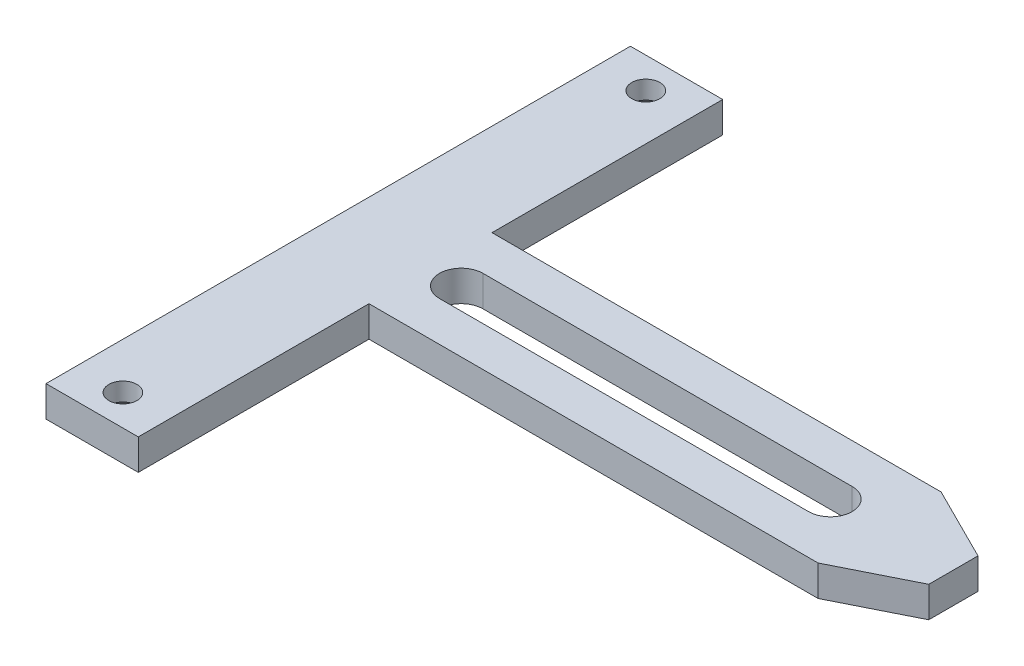
ISO-10303-21;
HEADER;
FILE_DESCRIPTION(('STEP AP214'),'2;1');
FILE_NAME('part.step','',(''),(''),'','','');
FILE_SCHEMA(('AUTOMOTIVE_DESIGN { 1 0 10303 214 1 1 1 1 }'));
ENDSEC;
DATA;
#1=APPLICATION_CONTEXT('core data for automotive mechanical design processes');
#2=APPLICATION_PROTOCOL_DEFINITION('international standard','automotive_design',2000,#1);
#3=PRODUCT_CONTEXT('',#1,'mechanical');
#4=PRODUCT('Part','Part','',(#3));
#5=PRODUCT_RELATED_PRODUCT_CATEGORY('part','',(#4));
#6=PRODUCT_DEFINITION_FORMATION('','',#4);
#7=PRODUCT_DEFINITION_CONTEXT('part definition',#1,'design');
#8=PRODUCT_DEFINITION('design','',#6,#7);
#9=PRODUCT_DEFINITION_SHAPE('','',#8);
#10=(LENGTH_UNIT() NAMED_UNIT(*) SI_UNIT(.MILLI.,.METRE.));
#11=(NAMED_UNIT(*) PLANE_ANGLE_UNIT() SI_UNIT($,.RADIAN.));
#12=(NAMED_UNIT(*) SI_UNIT($,.STERADIAN.) SOLID_ANGLE_UNIT());
#13=UNCERTAINTY_MEASURE_WITH_UNIT(LENGTH_MEASURE(1.E-05),#10,'distance_accuracy_value','');
#14=(GEOMETRIC_REPRESENTATION_CONTEXT(3) GLOBAL_UNCERTAINTY_ASSIGNED_CONTEXT((#13)) GLOBAL_UNIT_ASSIGNED_CONTEXT((#10,
#11,#12)) REPRESENTATION_CONTEXT('',''));
#15=CARTESIAN_POINT('',(0.,0.,0.));
#16=DIRECTION('',(0.,0.,1.));
#17=DIRECTION('',(1.,0.,0.));
#18=AXIS2_PLACEMENT_3D('',#15,#16,#17);
#19=CARTESIAN_POINT('',(-31.75,1.5875,30.1625));
#20=DIRECTION('',(-1.,0.,0.));
#21=DIRECTION('',(0.,0.,1.));
#22=AXIS2_PLACEMENT_3D('',#19,#20,#21);
#23=PLANE('',#22);
#24=DIRECTION('',(0.,0.,-1.));
#25=VECTOR('',#24,1.);
#26=CARTESIAN_POINT('',(-31.75,-1.5875,30.1625));
#27=LINE('',#26,#25);
#28=CARTESIAN_POINT('',(-31.75,-1.5875,30.1625));
#29=VERTEX_POINT('',#28);
#30=CARTESIAN_POINT('',(-31.75,-1.5875,-30.1625));
#31=VERTEX_POINT('',#30);
#32=EDGE_CURVE('E218',#29,#31,#27,.T.);
#33=ORIENTED_EDGE('',*,*,#32,.F.);
#34=DIRECTION('',(0.,-1.,0.));
#35=VECTOR('',#34,1.);
#36=CARTESIAN_POINT('',(-31.75,1.5875,30.1625));
#37=LINE('',#36,#35);
#38=CARTESIAN_POINT('',(-31.75,1.5875,30.1625));
#39=VERTEX_POINT('',#38);
#40=EDGE_CURVE('E11',#39,#29,#37,.T.);
#41=ORIENTED_EDGE('',*,*,#40,.F.);
#42=DIRECTION('',(0.,0.,-1.));
#43=VECTOR('',#42,1.);
#44=CARTESIAN_POINT('',(-31.75,1.5875,30.1625));
#45=LINE('',#44,#43);
#46=CARTESIAN_POINT('',(-31.75,1.5875,-30.1625));
#47=VERTEX_POINT('',#46);
#48=EDGE_CURVE('E260',#39,#47,#45,.T.);
#49=ORIENTED_EDGE('',*,*,#48,.T.);
#50=DIRECTION('',(0.,-1.,0.));
#51=VECTOR('',#50,1.);
#52=CARTESIAN_POINT('',(-31.75,1.5875,-30.1625));
#53=LINE('',#52,#51);
#54=EDGE_CURVE('E45',#47,#31,#53,.T.);
#55=ORIENTED_EDGE('',*,*,#54,.T.);
#56=EDGE_LOOP('',(#33,#41,#49,#55));
#57=FACE_BOUND('',#56,.T.);
#58=ADVANCED_FACE('F42',(#57),#23,.T.);
#59=CARTESIAN_POINT('',(-31.75,1.5875,30.1625));
#60=DIRECTION('',(0.,0.,-1.));
#61=DIRECTION('',(-1.,0.,0.));
#62=AXIS2_PLACEMENT_3D('',#59,#60,#61);
#63=PLANE('',#62);
#64=DIRECTION('',(1.,0.,0.));
#65=VECTOR('',#64,1.);
#66=CARTESIAN_POINT('',(-31.75,-1.5875,30.1625));
#67=LINE('',#66,#65);
#68=CARTESIAN_POINT('',(-22.225,-1.5875,30.1625));
#69=VERTEX_POINT('',#68);
#70=EDGE_CURVE('E265',#29,#69,#67,.T.);
#71=ORIENTED_EDGE('',*,*,#70,.T.);
#72=DIRECTION('',(0.,1.,0.));
#73=VECTOR('',#72,1.);
#74=CARTESIAN_POINT('',(-22.225,-1.5885,30.1625));
#75=LINE('',#74,#73);
#76=CARTESIAN_POINT('',(-22.225,1.5875,30.1625));
#77=VERTEX_POINT('',#76);
#78=EDGE_CURVE('E248',#69,#77,#75,.T.);
#79=ORIENTED_EDGE('',*,*,#78,.T.);
#80=DIRECTION('',(1.,0.,0.));
#81=VECTOR('',#80,1.);
#82=CARTESIAN_POINT('',(-31.75,1.5875,30.1625));
#83=LINE('',#82,#81);
#84=EDGE_CURVE('E273',#39,#77,#83,.T.);
#85=ORIENTED_EDGE('',*,*,#84,.F.);
#86=ORIENTED_EDGE('',*,*,#40,.T.);
#87=EDGE_LOOP('',(#71,#79,#85,#86));
#88=FACE_BOUND('',#87,.T.);
#89=ADVANCED_FACE('F292',(#88),#63,.F.);
#90=CARTESIAN_POINT('',(31.75,1.5875,30.1625));
#91=DIRECTION('',(-1.,0.,0.));
#92=DIRECTION('',(0.,0.,1.));
#93=AXIS2_PLACEMENT_3D('',#90,#91,#92);
#94=PLANE('',#93);
#95=DIRECTION('',(0.,0.,-1.));
#96=VECTOR('',#95,1.);
#97=CARTESIAN_POINT('',(31.75,-1.5875,30.1625));
#98=LINE('',#97,#96);
#99=CARTESIAN_POINT('',(31.75,-1.5875,2.54000000000001));
#100=VERTEX_POINT('',#99);
#101=CARTESIAN_POINT('',(31.75,-1.5875,-2.53999999999999));
#102=VERTEX_POINT('',#101);
#103=EDGE_CURVE('E284',#100,#102,#98,.T.);
#104=ORIENTED_EDGE('',*,*,#103,.T.);
#105=DIRECTION('',(0.,1.,0.));
#106=VECTOR('',#105,1.);
#107=CARTESIAN_POINT('',(31.75,-1.5885,-2.54));
#108=LINE('',#107,#106);
#109=CARTESIAN_POINT('',(31.75,1.5875,-2.54));
#110=VERTEX_POINT('',#109);
#111=EDGE_CURVE('E214',#102,#110,#108,.T.);
#112=ORIENTED_EDGE('',*,*,#111,.T.);
#113=DIRECTION('',(0.,0.,-1.));
#114=VECTOR('',#113,1.);
#115=CARTESIAN_POINT('',(31.75,1.5875,30.1625));
#116=LINE('',#115,#114);
#117=CARTESIAN_POINT('',(31.75,1.5875,2.54));
#118=VERTEX_POINT('',#117);
#119=EDGE_CURVE('E269',#118,#110,#116,.T.);
#120=ORIENTED_EDGE('',*,*,#119,.F.);
#121=DIRECTION('',(0.,1.,0.));
#122=VECTOR('',#121,1.);
#123=CARTESIAN_POINT('',(31.75,-1.5885,2.54));
#124=LINE('',#123,#122);
#125=EDGE_CURVE('E245',#100,#118,#124,.T.);
#126=ORIENTED_EDGE('',*,*,#125,.F.);
#127=EDGE_LOOP('',(#104,#112,#120,#126));
#128=FACE_BOUND('',#127,.T.);
#129=ADVANCED_FACE('F318',(#128),#94,.F.);
#130=CARTESIAN_POINT('',(-31.75,1.5875,-30.1625));
#131=DIRECTION('',(0.,0.,-1.));
#132=DIRECTION('',(-1.,0.,0.));
#133=AXIS2_PLACEMENT_3D('',#130,#131,#132);
#134=PLANE('',#133);
#135=DIRECTION('',(0.,1.,0.));
#136=VECTOR('',#135,1.);
#137=CARTESIAN_POINT('',(-22.225,-1.5885,-30.1625));
#138=LINE('',#137,#136);
#139=CARTESIAN_POINT('',(-22.225,-1.5875,-30.1625));
#140=VERTEX_POINT('',#139);
#141=CARTESIAN_POINT('',(-22.225,1.5875,-30.1625));
#142=VERTEX_POINT('',#141);
#143=EDGE_CURVE('E213',#140,#142,#138,.T.);
#144=ORIENTED_EDGE('',*,*,#143,.F.);
#145=DIRECTION('',(1.,0.,0.));
#146=VECTOR('',#145,1.);
#147=CARTESIAN_POINT('',(-31.75,-1.5875,-30.1625));
#148=LINE('',#147,#146);
#149=EDGE_CURVE('E280',#31,#140,#148,.T.);
#150=ORIENTED_EDGE('',*,*,#149,.F.);
#151=ORIENTED_EDGE('',*,*,#54,.F.);
#152=DIRECTION('',(1.,0.,0.));
#153=VECTOR('',#152,1.);
#154=CARTESIAN_POINT('',(-31.75,1.5875,-30.1625));
#155=LINE('',#154,#153);
#156=EDGE_CURVE('E264',#47,#142,#155,.T.);
#157=ORIENTED_EDGE('',*,*,#156,.T.);
#158=EDGE_LOOP('',(#144,#150,#151,#157));
#159=FACE_BOUND('',#158,.T.);
#160=ADVANCED_FACE('F303',(#159),#134,.T.);
#161=CARTESIAN_POINT('',(0.,1.5875,0.));
#162=DIRECTION('',(0.,-1.,0.));
#163=DIRECTION('',(0.,0.,-1.));
#164=AXIS2_PLACEMENT_3D('',#161,#162,#163);
#165=PLANE('',#164);
#166=CARTESIAN_POINT('',(-26.9875,1.5875,-26.9875));
#167=DIRECTION('',(0.,-1.,0.));
#168=DIRECTION('',(0.,0.,-1.));
#169=AXIS2_PLACEMENT_3D('',#166,#167,#168);
#170=CIRCLE('',#169,1.44999999999999);
#171=CARTESIAN_POINT('',(-26.9875,1.5875,-28.4375));
#172=VERTEX_POINT('',#171);
#173=EDGE_CURVE('E364',#172,#172,#170,.T.);
#174=ORIENTED_EDGE('',*,*,#173,.T.);
#175=EDGE_LOOP('',(#174));
#176=FACE_BOUND('',#175,.T.);
#177=CARTESIAN_POINT('',(-26.9875,1.5875,26.9875));
#178=DIRECTION('',(0.,-1.,0.));
#179=DIRECTION('',(0.,0.,-1.));
#180=AXIS2_PLACEMENT_3D('',#177,#178,#179);
#181=CIRCLE('',#180,1.44999999999999);
#182=CARTESIAN_POINT('',(-26.9875,1.5875,25.5375));
#183=VERTEX_POINT('',#182);
#184=EDGE_CURVE('E368',#183,#183,#181,.T.);
#185=ORIENTED_EDGE('',*,*,#184,.T.);
#186=EDGE_LOOP('',(#185));
#187=FACE_BOUND('',#186,.T.);
#188=DIRECTION('',(1.,0.,0.));
#189=VECTOR('',#188,1.);
#190=CARTESIAN_POINT('',(-19.05,1.5875,2.2479));
#191=LINE('',#190,#189);
#192=CARTESIAN_POINT('',(-19.05,1.5875,2.2479));
#193=VERTEX_POINT('',#192);
#194=CARTESIAN_POINT('',(19.05,1.5875,2.2479));
#195=VERTEX_POINT('',#194);
#196=EDGE_CURVE('E167',#193,#195,#191,.T.);
#197=ORIENTED_EDGE('',*,*,#196,.F.);
#198=CARTESIAN_POINT('',(-19.05,1.5875,0.));
#199=DIRECTION('',(0.,1.,0.));
#200=DIRECTION('',(0.,0.,1.));
#201=AXIS2_PLACEMENT_3D('',#198,#199,#200);
#202=CIRCLE('',#201,2.2479);
#203=CARTESIAN_POINT('',(-19.05,1.5875,-2.2479));
#204=VERTEX_POINT('',#203);
#205=EDGE_CURVE('E57',#204,#193,#202,.T.);
#206=ORIENTED_EDGE('',*,*,#205,.F.);
#207=DIRECTION('',(1.,0.,0.));
#208=VECTOR('',#207,1.);
#209=CARTESIAN_POINT('',(-19.05,1.5875,-2.2479));
#210=LINE('',#209,#208);
#211=CARTESIAN_POINT('',(19.05,1.5875,-2.2479));
#212=VERTEX_POINT('',#211);
#213=EDGE_CURVE('E156',#204,#212,#210,.T.);
#214=ORIENTED_EDGE('',*,*,#213,.T.);
#215=CARTESIAN_POINT('',(19.05,1.5875,0.));
#216=DIRECTION('',(0.,1.,0.));
#217=DIRECTION('',(0.,0.,1.));
#218=AXIS2_PLACEMENT_3D('',#215,#216,#217);
#219=CIRCLE('',#218,2.2479);
#220=EDGE_CURVE('E176',#195,#212,#219,.T.);
#221=ORIENTED_EDGE('',*,*,#220,.F.);
#222=EDGE_LOOP('',(#197,#206,#214,#221));
#223=FACE_BOUND('',#222,.T.);
#224=ORIENTED_EDGE('',*,*,#119,.T.);
#225=DIRECTION('',(0.894427190999916,0.,0.447213595499958));
#226=VECTOR('',#225,1.);
#227=CARTESIAN_POINT('',(31.75,1.5875,-2.54));
#228=LINE('',#227,#226);
#229=CARTESIAN_POINT('',(24.13,1.5875,-6.35));
#230=VERTEX_POINT('',#229);
#231=EDGE_CURVE('E210',#230,#110,#228,.T.);
#232=ORIENTED_EDGE('',*,*,#231,.F.);
#233=DIRECTION('',(1.,0.,0.));
#234=VECTOR('',#233,1.);
#235=CARTESIAN_POINT('',(24.13,1.5875,-6.35));
#236=LINE('',#235,#234);
#237=CARTESIAN_POINT('',(-22.225,1.5875,-6.35));
#238=VERTEX_POINT('',#237);
#239=EDGE_CURVE('E206',#238,#230,#236,.T.);
#240=ORIENTED_EDGE('',*,*,#239,.F.);
#241=DIRECTION('',(0.,0.,1.));
#242=VECTOR('',#241,1.);
#243=CARTESIAN_POINT('',(-22.225,1.5875,-30.1625));
#244=LINE('',#243,#242);
#245=EDGE_CURVE('E202',#142,#238,#244,.T.);
#246=ORIENTED_EDGE('',*,*,#245,.F.);
#247=ORIENTED_EDGE('',*,*,#156,.F.);
#248=ORIENTED_EDGE('',*,*,#48,.F.);
#249=ORIENTED_EDGE('',*,*,#84,.T.);
#250=DIRECTION('',(0.,0.,1.));
#251=VECTOR('',#250,1.);
#252=CARTESIAN_POINT('',(-22.225,1.5875,30.1625));
#253=LINE('',#252,#251);
#254=CARTESIAN_POINT('',(-22.225,1.5875,6.35));
#255=VERTEX_POINT('',#254);
#256=EDGE_CURVE('E241',#255,#77,#253,.T.);
#257=ORIENTED_EDGE('',*,*,#256,.F.);
#258=DIRECTION('',(-1.,0.,0.));
#259=VECTOR('',#258,1.);
#260=CARTESIAN_POINT('',(24.13,1.5875,6.35));
#261=LINE('',#260,#259);
#262=CARTESIAN_POINT('',(24.13,1.5875,6.35));
#263=VERTEX_POINT('',#262);
#264=EDGE_CURVE('E237',#263,#255,#261,.T.);
#265=ORIENTED_EDGE('',*,*,#264,.F.);
#266=DIRECTION('',(-0.894427190999916,0.,0.447213595499958));
#267=VECTOR('',#266,1.);
#268=CARTESIAN_POINT('',(31.75,1.5875,2.54));
#269=LINE('',#268,#267);
#270=EDGE_CURVE('E233',#118,#263,#269,.T.);
#271=ORIENTED_EDGE('',*,*,#270,.F.);
#272=EDGE_LOOP('',(#224,#232,#240,#246,#247,#248,#249,#257,#265,#271));
#273=FACE_BOUND('',#272,.T.);
#274=ADVANCED_FACE('F326',(#176,#187,#223,#273),#165,.F.);
#275=CARTESIAN_POINT('',(0.,-1.5875,0.));
#276=DIRECTION('',(0.,-1.,0.));
#277=DIRECTION('',(0.,0.,-1.));
#278=AXIS2_PLACEMENT_3D('',#275,#276,#277);
#279=PLANE('',#278);
#280=CARTESIAN_POINT('',(-26.9875,-1.5875,-26.9875));
#281=DIRECTION('',(0.,-1.,0.));
#282=DIRECTION('',(0.,0.,-1.));
#283=AXIS2_PLACEMENT_3D('',#280,#281,#282);
#284=CIRCLE('',#283,2.75);
#285=CARTESIAN_POINT('',(-26.9875,-1.5875,-29.7375));
#286=VERTEX_POINT('',#285);
#287=EDGE_CURVE('E392',#286,#286,#284,.T.);
#288=ORIENTED_EDGE('',*,*,#287,.F.);
#289=EDGE_LOOP('',(#288));
#290=FACE_BOUND('',#289,.T.);
#291=CARTESIAN_POINT('',(-26.9875,-1.5875,26.9875));
#292=DIRECTION('',(0.,-1.,0.));
#293=DIRECTION('',(0.,0.,-1.));
#294=AXIS2_PLACEMENT_3D('',#291,#292,#293);
#295=CIRCLE('',#294,2.75);
#296=CARTESIAN_POINT('',(-26.9875,-1.5875,24.2375));
#297=VERTEX_POINT('',#296);
#298=EDGE_CURVE('E382',#297,#297,#295,.T.);
#299=ORIENTED_EDGE('',*,*,#298,.F.);
#300=EDGE_LOOP('',(#299));
#301=FACE_BOUND('',#300,.T.);
#302=CARTESIAN_POINT('',(-19.05,-1.5875,0.));
#303=DIRECTION('',(0.,-1.,0.));
#304=DIRECTION('',(0.,0.,-1.));
#305=AXIS2_PLACEMENT_3D('',#302,#303,#304);
#306=CIRCLE('',#305,2.2479);
#307=CARTESIAN_POINT('',(-19.05,-1.5875,-2.2479));
#308=VERTEX_POINT('',#307);
#309=CARTESIAN_POINT('',(-19.05,-1.5875,2.2479));
#310=VERTEX_POINT('',#309);
#311=EDGE_CURVE('E153',#308,#310,#306,.F.);
#312=ORIENTED_EDGE('',*,*,#311,.T.);
#313=DIRECTION('',(1.,0.,0.));
#314=VECTOR('',#313,1.);
#315=CARTESIAN_POINT('',(-19.05,-1.5875,2.2479));
#316=LINE('',#315,#314);
#317=CARTESIAN_POINT('',(19.05,-1.5875,2.2479));
#318=VERTEX_POINT('',#317);
#319=EDGE_CURVE('E141',#310,#318,#316,.T.);
#320=ORIENTED_EDGE('',*,*,#319,.T.);
#321=CARTESIAN_POINT('',(19.05,-1.5875,0.));
#322=DIRECTION('',(0.,-1.,0.));
#323=DIRECTION('',(0.,0.,-1.));
#324=AXIS2_PLACEMENT_3D('',#321,#322,#323);
#325=CIRCLE('',#324,2.2479);
#326=CARTESIAN_POINT('',(19.05,-1.5875,-2.2479));
#327=VERTEX_POINT('',#326);
#328=EDGE_CURVE('E170',#318,#327,#325,.F.);
#329=ORIENTED_EDGE('',*,*,#328,.T.);
#330=DIRECTION('',(1.,0.,0.));
#331=VECTOR('',#330,1.);
#332=CARTESIAN_POINT('',(-19.05,-1.5875,-2.2479));
#333=LINE('',#332,#331);
#334=EDGE_CURVE('E161',#308,#327,#333,.T.);
#335=ORIENTED_EDGE('',*,*,#334,.F.);
#336=EDGE_LOOP('',(#312,#320,#329,#335));
#337=FACE_BOUND('',#336,.T.);
#338=DIRECTION('',(0.894427190999916,0.,0.447213595499958));
#339=VECTOR('',#338,1.);
#340=CARTESIAN_POINT('',(31.75,-1.5875,-2.54));
#341=LINE('',#340,#339);
#342=CARTESIAN_POINT('',(24.13,-1.5875,-6.35));
#343=VERTEX_POINT('',#342);
#344=EDGE_CURVE('E198',#343,#102,#341,.T.);
#345=ORIENTED_EDGE('',*,*,#344,.T.);
#346=ORIENTED_EDGE('',*,*,#103,.F.);
#347=DIRECTION('',(-0.894427190999916,0.,0.447213595499958));
#348=VECTOR('',#347,1.);
#349=CARTESIAN_POINT('',(31.75,-1.5875,2.54));
#350=LINE('',#349,#348);
#351=CARTESIAN_POINT('',(24.13,-1.5875,6.35));
#352=VERTEX_POINT('',#351);
#353=EDGE_CURVE('E229',#100,#352,#350,.T.);
#354=ORIENTED_EDGE('',*,*,#353,.T.);
#355=DIRECTION('',(-1.,0.,0.));
#356=VECTOR('',#355,1.);
#357=CARTESIAN_POINT('',(24.13,-1.5875,6.35));
#358=LINE('',#357,#356);
#359=CARTESIAN_POINT('',(-22.225,-1.5875,6.35));
#360=VERTEX_POINT('',#359);
#361=EDGE_CURVE('E194',#352,#360,#358,.T.);
#362=ORIENTED_EDGE('',*,*,#361,.T.);
#363=DIRECTION('',(0.,0.,1.));
#364=VECTOR('',#363,1.);
#365=CARTESIAN_POINT('',(-22.225,-1.5875,30.1625));
#366=LINE('',#365,#364);
#367=EDGE_CURVE('E149',#360,#69,#366,.T.);
#368=ORIENTED_EDGE('',*,*,#367,.T.);
#369=ORIENTED_EDGE('',*,*,#70,.F.);
#370=ORIENTED_EDGE('',*,*,#32,.T.);
#371=ORIENTED_EDGE('',*,*,#149,.T.);
#372=DIRECTION('',(0.,0.,1.));
#373=VECTOR('',#372,1.);
#374=CARTESIAN_POINT('',(-22.225,-1.5875,-30.1625));
#375=LINE('',#374,#373);
#376=CARTESIAN_POINT('',(-22.225,-1.5875,-6.35));
#377=VERTEX_POINT('',#376);
#378=EDGE_CURVE('E189',#140,#377,#375,.T.);
#379=ORIENTED_EDGE('',*,*,#378,.T.);
#380=DIRECTION('',(1.,0.,0.));
#381=VECTOR('',#380,1.);
#382=CARTESIAN_POINT('',(24.13,-1.5875,-6.35));
#383=LINE('',#382,#381);
#384=EDGE_CURVE('E193',#377,#343,#383,.T.);
#385=ORIENTED_EDGE('',*,*,#384,.T.);
#386=EDGE_LOOP('',(#345,#346,#354,#362,#368,#369,#370,#371,#379,#385));
#387=FACE_BOUND('',#386,.T.);
#388=ADVANCED_FACE('F159',(#290,#301,#337,#387),#279,.T.);
#389=CARTESIAN_POINT('',(31.75,-1.5885,2.54));
#390=DIRECTION('',(-0.447213595499958,0.,-0.894427190999916));
#391=DIRECTION('',(-0.894427190999916,0.,0.447213595499958));
#392=AXIS2_PLACEMENT_3D('',#389,#390,#391);
#393=PLANE('',#392);
#394=ORIENTED_EDGE('',*,*,#125,.T.);
#395=ORIENTED_EDGE('',*,*,#270,.T.);
#396=DIRECTION('',(0.,1.,0.));
#397=VECTOR('',#396,1.);
#398=CARTESIAN_POINT('',(24.13,-1.5885,6.35));
#399=LINE('',#398,#397);
#400=EDGE_CURVE('E244',#352,#263,#399,.T.);
#401=ORIENTED_EDGE('',*,*,#400,.F.);
#402=ORIENTED_EDGE('',*,*,#353,.F.);
#403=EDGE_LOOP('',(#394,#395,#401,#402));
#404=FACE_BOUND('',#403,.T.);
#405=ADVANCED_FACE('F322',(#404),#393,.F.);
#406=CARTESIAN_POINT('',(-22.225,-1.5885,30.1625));
#407=DIRECTION('',(-1.,0.,0.));
#408=DIRECTION('',(0.,0.,1.));
#409=AXIS2_PLACEMENT_3D('',#406,#407,#408);
#410=PLANE('',#409);
#411=DIRECTION('',(0.,1.,0.));
#412=VECTOR('',#411,1.);
#413=CARTESIAN_POINT('',(-22.225,-1.5885,6.35));
#414=LINE('',#413,#412);
#415=EDGE_CURVE('E252',#360,#255,#414,.T.);
#416=ORIENTED_EDGE('',*,*,#415,.T.);
#417=ORIENTED_EDGE('',*,*,#256,.T.);
#418=ORIENTED_EDGE('',*,*,#78,.F.);
#419=ORIENTED_EDGE('',*,*,#367,.F.);
#420=EDGE_LOOP('',(#416,#417,#418,#419));
#421=FACE_BOUND('',#420,.T.);
#422=ADVANCED_FACE('F331',(#421),#410,.F.);
#423=CARTESIAN_POINT('',(24.13,-1.5885,6.35));
#424=DIRECTION('',(0.,0.,-1.));
#425=DIRECTION('',(-1.,0.,0.));
#426=AXIS2_PLACEMENT_3D('',#423,#424,#425);
#427=PLANE('',#426);
#428=ORIENTED_EDGE('',*,*,#400,.T.);
#429=ORIENTED_EDGE('',*,*,#264,.T.);
#430=ORIENTED_EDGE('',*,*,#415,.F.);
#431=ORIENTED_EDGE('',*,*,#361,.F.);
#432=EDGE_LOOP('',(#428,#429,#430,#431));
#433=FACE_BOUND('',#432,.T.);
#434=ADVANCED_FACE('F329',(#433),#427,.F.);
#435=CARTESIAN_POINT('',(31.75,-1.5885,-2.54));
#436=DIRECTION('',(-0.447213595499958,0.,0.894427190999916));
#437=DIRECTION('',(0.894427190999916,0.,0.447213595499958));
#438=AXIS2_PLACEMENT_3D('',#435,#436,#437);
#439=PLANE('',#438);
#440=DIRECTION('',(0.,1.,0.));
#441=VECTOR('',#440,1.);
#442=CARTESIAN_POINT('',(24.13,-1.5885,-6.35));
#443=LINE('',#442,#441);
#444=EDGE_CURVE('E219',#343,#230,#443,.T.);
#445=ORIENTED_EDGE('',*,*,#444,.T.);
#446=ORIENTED_EDGE('',*,*,#231,.T.);
#447=ORIENTED_EDGE('',*,*,#111,.F.);
#448=ORIENTED_EDGE('',*,*,#344,.F.);
#449=EDGE_LOOP('',(#445,#446,#447,#448));
#450=FACE_BOUND('',#449,.T.);
#451=ADVANCED_FACE('F314',(#450),#439,.F.);
#452=CARTESIAN_POINT('',(24.13,-1.5885,-6.35));
#453=DIRECTION('',(0.,0.,1.));
#454=DIRECTION('',(1.,0.,0.));
#455=AXIS2_PLACEMENT_3D('',#452,#453,#454);
#456=PLANE('',#455);
#457=DIRECTION('',(0.,1.,0.));
#458=VECTOR('',#457,1.);
#459=CARTESIAN_POINT('',(-22.225,-1.5885,-6.35));
#460=LINE('',#459,#458);
#461=EDGE_CURVE('E222',#377,#238,#460,.T.);
#462=ORIENTED_EDGE('',*,*,#461,.T.);
#463=ORIENTED_EDGE('',*,*,#239,.T.);
#464=ORIENTED_EDGE('',*,*,#444,.F.);
#465=ORIENTED_EDGE('',*,*,#384,.F.);
#466=EDGE_LOOP('',(#462,#463,#464,#465));
#467=FACE_BOUND('',#466,.T.);
#468=ADVANCED_FACE('F311',(#467),#456,.F.);
#469=CARTESIAN_POINT('',(-22.225,-1.5885,-30.1625));
#470=DIRECTION('',(-1.,0.,0.));
#471=DIRECTION('',(0.,0.,1.));
#472=AXIS2_PLACEMENT_3D('',#469,#470,#471);
#473=PLANE('',#472);
#474=ORIENTED_EDGE('',*,*,#143,.T.);
#475=ORIENTED_EDGE('',*,*,#245,.T.);
#476=ORIENTED_EDGE('',*,*,#461,.F.);
#477=ORIENTED_EDGE('',*,*,#378,.F.);
#478=EDGE_LOOP('',(#474,#475,#476,#477));
#479=FACE_BOUND('',#478,.T.);
#480=ADVANCED_FACE('F306',(#479),#473,.F.);
#481=CARTESIAN_POINT('',(-19.05,-1.5885,0.));
#482=DIRECTION('',(0.,1.,0.));
#483=DIRECTION('',(0.,0.,1.));
#484=AXIS2_PLACEMENT_3D('',#481,#482,#483);
#485=CYLINDRICAL_SURFACE('',#484,2.2479);
#486=DIRECTION('',(0.,1.,0.));
#487=VECTOR('',#486,1.);
#488=CARTESIAN_POINT('',(-19.05,-1.5885,-2.2479));
#489=LINE('',#488,#487);
#490=EDGE_CURVE('E150',#308,#204,#489,.T.);
#491=ORIENTED_EDGE('',*,*,#490,.T.);
#492=ORIENTED_EDGE('',*,*,#205,.T.);
#493=DIRECTION('',(0.,1.,0.));
#494=VECTOR('',#493,1.);
#495=CARTESIAN_POINT('',(-19.05,-1.5885,2.2479));
#496=LINE('',#495,#494);
#497=EDGE_CURVE('E143',#310,#193,#496,.T.);
#498=ORIENTED_EDGE('',*,*,#497,.F.);
#499=ORIENTED_EDGE('',*,*,#311,.F.);
#500=EDGE_LOOP('',(#491,#492,#498,#499));
#501=FACE_BOUND('',#500,.T.);
#502=ADVANCED_FACE('F152',(#501),#485,.F.);
#503=CARTESIAN_POINT('',(-19.05,-1.5885,-2.2479));
#504=DIRECTION('',(0.,0.,1.));
#505=DIRECTION('',(1.,0.,0.));
#506=AXIS2_PLACEMENT_3D('',#503,#504,#505);
#507=PLANE('',#506);
#508=ORIENTED_EDGE('',*,*,#334,.T.);
#509=DIRECTION('',(0.,1.,0.));
#510=VECTOR('',#509,1.);
#511=CARTESIAN_POINT('',(19.05,-1.5885,-2.2479));
#512=LINE('',#511,#510);
#513=EDGE_CURVE('E185',#327,#212,#512,.T.);
#514=ORIENTED_EDGE('',*,*,#513,.T.);
#515=ORIENTED_EDGE('',*,*,#213,.F.);
#516=ORIENTED_EDGE('',*,*,#490,.F.);
#517=EDGE_LOOP('',(#508,#514,#515,#516));
#518=FACE_BOUND('',#517,.T.);
#519=ADVANCED_FACE('F418',(#518),#507,.T.);
#520=CARTESIAN_POINT('',(19.05,-1.5885,0.));
#521=DIRECTION('',(0.,1.,0.));
#522=DIRECTION('',(0.,0.,1.));
#523=AXIS2_PLACEMENT_3D('',#520,#521,#522);
#524=CYLINDRICAL_SURFACE('',#523,2.2479);
#525=DIRECTION('',(0.,1.,0.));
#526=VECTOR('',#525,1.);
#527=CARTESIAN_POINT('',(19.05,-1.5885,2.2479));
#528=LINE('',#527,#526);
#529=EDGE_CURVE('E65',#318,#195,#528,.T.);
#530=ORIENTED_EDGE('',*,*,#529,.T.);
#531=ORIENTED_EDGE('',*,*,#220,.T.);
#532=ORIENTED_EDGE('',*,*,#513,.F.);
#533=ORIENTED_EDGE('',*,*,#328,.F.);
#534=EDGE_LOOP('',(#530,#531,#532,#533));
#535=FACE_BOUND('',#534,.T.);
#536=ADVANCED_FACE('F373',(#535),#524,.F.);
#537=CARTESIAN_POINT('',(-19.05,-1.5885,2.2479));
#538=DIRECTION('',(0.,0.,1.));
#539=DIRECTION('',(1.,0.,0.));
#540=AXIS2_PLACEMENT_3D('',#537,#538,#539);
#541=PLANE('',#540);
#542=ORIENTED_EDGE('',*,*,#497,.T.);
#543=ORIENTED_EDGE('',*,*,#196,.T.);
#544=ORIENTED_EDGE('',*,*,#529,.F.);
#545=ORIENTED_EDGE('',*,*,#319,.F.);
#546=EDGE_LOOP('',(#542,#543,#544,#545));
#547=FACE_BOUND('',#546,.T.);
#548=ADVANCED_FACE('F142',(#547),#541,.F.);
#549=CARTESIAN_POINT('',(-26.9875,-1.5875,26.9875));
#550=DIRECTION('',(0.,-1.,0.));
#551=DIRECTION('',(0.,0.,-1.));
#552=AXIS2_PLACEMENT_3D('',#549,#550,#551);
#553=CYLINDRICAL_SURFACE('',#552,1.44999999999999);
#554=ORIENTED_EDGE('',*,*,#184,.F.);
#555=EDGE_LOOP('',(#554));
#556=FACE_BOUND('',#555,.T.);
#557=CARTESIAN_POINT('',(-26.9875,-0.28749999999999,26.9875));
#558=DIRECTION('',(0.,-1.,0.));
#559=DIRECTION('',(0.,0.,-1.));
#560=AXIS2_PLACEMENT_3D('',#557,#558,#559);
#561=CIRCLE('',#560,1.44999999999999);
#562=CARTESIAN_POINT('',(-26.9875,-0.28749999999999,25.5375));
#563=VERTEX_POINT('',#562);
#564=EDGE_CURVE('E376',#563,#563,#561,.T.);
#565=ORIENTED_EDGE('',*,*,#564,.T.);
#566=EDGE_LOOP('',(#565));
#567=FACE_BOUND('',#566,.T.);
#568=ADVANCED_FACE('F404',(#556,#567),#553,.F.);
#569=CARTESIAN_POINT('',(-26.9875,-1.5875,26.9875));
#570=DIRECTION('',(0.,-1.,0.));
#571=DIRECTION('',(0.,0.,-1.));
#572=AXIS2_PLACEMENT_3D('',#569,#570,#571);
#573=CONICAL_SURFACE('',#572,2.75,0.785398163397449);
#574=ORIENTED_EDGE('',*,*,#564,.F.);
#575=EDGE_LOOP('',(#574));
#576=FACE_BOUND('',#575,.T.);
#577=ORIENTED_EDGE('',*,*,#298,.T.);
#578=EDGE_LOOP('',(#577));
#579=FACE_BOUND('',#578,.T.);
#580=ADVANCED_FACE('F401',(#576,#579),#573,.F.);
#581=CARTESIAN_POINT('',(-26.9875,-1.5875,-26.9875));
#582=DIRECTION('',(0.,-1.,0.));
#583=DIRECTION('',(0.,0.,-1.));
#584=AXIS2_PLACEMENT_3D('',#581,#582,#583);
#585=CYLINDRICAL_SURFACE('',#584,1.44999999999999);
#586=ORIENTED_EDGE('',*,*,#173,.F.);
#587=EDGE_LOOP('',(#586));
#588=FACE_BOUND('',#587,.T.);
#589=CARTESIAN_POINT('',(-26.9875,-0.28749999999999,-26.9875));
#590=DIRECTION('',(0.,-1.,0.));
#591=DIRECTION('',(0.,0.,-1.));
#592=AXIS2_PLACEMENT_3D('',#589,#590,#591);
#593=CIRCLE('',#592,1.44999999999999);
#594=CARTESIAN_POINT('',(-26.9875,-0.28749999999999,-28.4375));
#595=VERTEX_POINT('',#594);
#596=EDGE_CURVE('E388',#595,#595,#593,.T.);
#597=ORIENTED_EDGE('',*,*,#596,.T.);
#598=EDGE_LOOP('',(#597));
#599=FACE_BOUND('',#598,.T.);
#600=ADVANCED_FACE('F403',(#588,#599),#585,.F.);
#601=CARTESIAN_POINT('',(-26.9875,-1.5875,-26.9875));
#602=DIRECTION('',(0.,-1.,0.));
#603=DIRECTION('',(0.,0.,-1.));
#604=AXIS2_PLACEMENT_3D('',#601,#602,#603);
#605=CONICAL_SURFACE('',#604,2.75,0.785398163397449);
#606=ORIENTED_EDGE('',*,*,#596,.F.);
#607=EDGE_LOOP('',(#606));
#608=FACE_BOUND('',#607,.T.);
#609=ORIENTED_EDGE('',*,*,#287,.T.);
#610=EDGE_LOOP('',(#609));
#611=FACE_BOUND('',#610,.T.);
#612=ADVANCED_FACE('F397',(#608,#611),#605,.F.);
#613=CLOSED_SHELL('',(#58,#89,#129,#160,#274,#388,#405,#422,#434,#451,#468,#480,#502,#519,#536,
#548,#568,#580,#600,#612));
#614=MANIFOLD_SOLID_BREP('B2',#613);
#615=ADVANCED_BREP_SHAPE_REPRESENTATION('',(#18,#614),#14);
#616=SHAPE_DEFINITION_REPRESENTATION(#9,#615);
ENDSEC;
END-ISO-10303-21;
